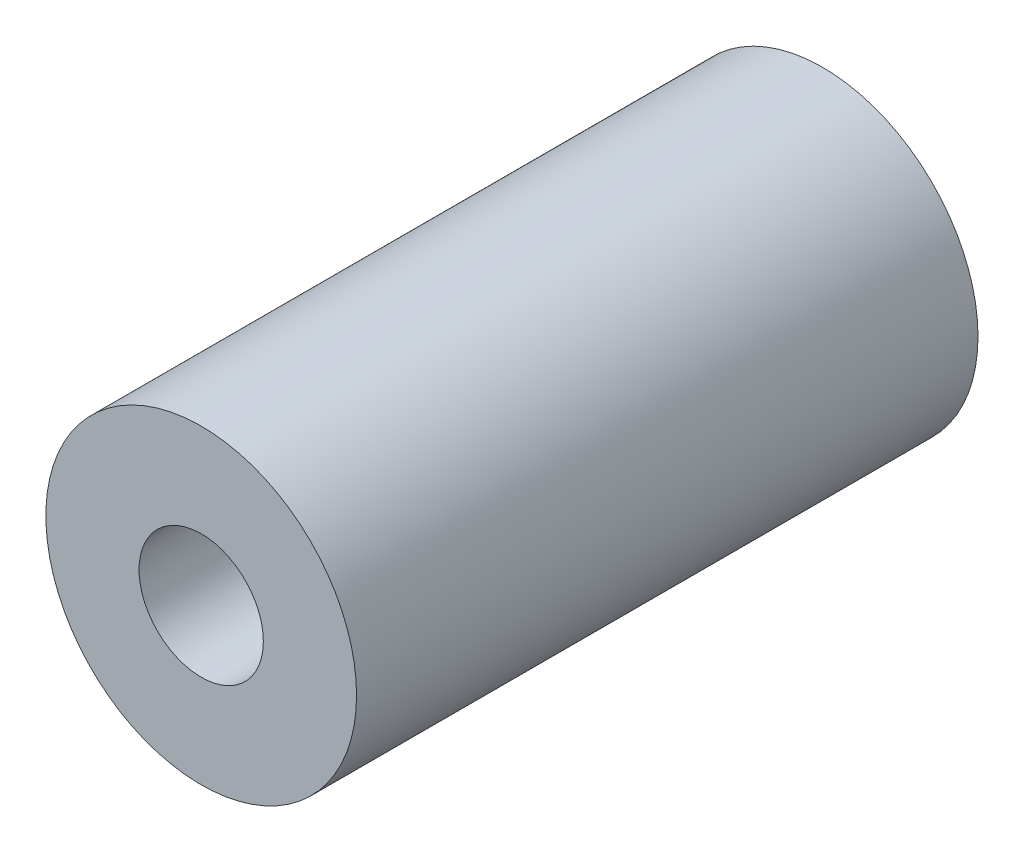
ISO-10303-21;
HEADER;
FILE_DESCRIPTION(('STEP AP214'),'2;1');
FILE_NAME('part.step','',(''),(''),'','','');
FILE_SCHEMA(('AUTOMOTIVE_DESIGN { 1 0 10303 214 1 1 1 1 }'));
ENDSEC;
DATA;
#1=APPLICATION_CONTEXT('core data for automotive mechanical design processes');
#2=APPLICATION_PROTOCOL_DEFINITION('international standard','automotive_design',2000,#1);
#3=PRODUCT_CONTEXT('',#1,'mechanical');
#4=PRODUCT('Part','Part','',(#3));
#5=PRODUCT_RELATED_PRODUCT_CATEGORY('part','',(#4));
#6=PRODUCT_DEFINITION_FORMATION('','',#4);
#7=PRODUCT_DEFINITION_CONTEXT('part definition',#1,'design');
#8=PRODUCT_DEFINITION('design','',#6,#7);
#9=PRODUCT_DEFINITION_SHAPE('','',#8);
#10=(LENGTH_UNIT() NAMED_UNIT(*) SI_UNIT(.MILLI.,.METRE.));
#11=(NAMED_UNIT(*) PLANE_ANGLE_UNIT() SI_UNIT($,.RADIAN.));
#12=(NAMED_UNIT(*) SI_UNIT($,.STERADIAN.) SOLID_ANGLE_UNIT());
#13=UNCERTAINTY_MEASURE_WITH_UNIT(LENGTH_MEASURE(1.E-05),#10,'distance_accuracy_value','');
#14=(GEOMETRIC_REPRESENTATION_CONTEXT(3) GLOBAL_UNCERTAINTY_ASSIGNED_CONTEXT((#13)) GLOBAL_UNIT_ASSIGNED_CONTEXT((#10,
#11,#12)) REPRESENTATION_CONTEXT('',''));
#15=CARTESIAN_POINT('',(0.,0.,0.));
#16=DIRECTION('',(0.,0.,1.));
#17=DIRECTION('',(1.,0.,0.));
#18=AXIS2_PLACEMENT_3D('',#15,#16,#17);
#19=CARTESIAN_POINT('',(0.,0.,-19.05));
#20=DIRECTION('',(0.,0.,1.));
#21=DIRECTION('',(1.,0.,0.));
#22=AXIS2_PLACEMENT_3D('',#19,#20,#21);
#23=CYLINDRICAL_SURFACE('',#22,9.525);
#24=CARTESIAN_POINT('',(0.,0.,-19.05));
#25=DIRECTION('',(0.,0.,1.));
#26=DIRECTION('',(1.,0.,0.));
#27=AXIS2_PLACEMENT_3D('',#24,#25,#26);
#28=CIRCLE('',#27,9.525);
#29=CARTESIAN_POINT('',(9.525,0.,-19.05));
#30=VERTEX_POINT('',#29);
#31=EDGE_CURVE('E10',#30,#30,#28,.T.);
#32=CARTESIAN_POINT('',(0.,0.,19.05));
#33=DIRECTION('',(0.,0.,1.));
#34=DIRECTION('',(1.,0.,0.));
#35=AXIS2_PLACEMENT_3D('',#32,#33,#34);
#36=CIRCLE('',#35,9.525);
#37=CARTESIAN_POINT('',(9.525,0.,19.05));
#38=VERTEX_POINT('',#37);
#39=EDGE_CURVE('E49',#38,#38,#36,.T.);
#40=CARTESIAN_POINT('',(9.525,0.,-19.05));
#41=CARTESIAN_POINT('',(9.525,0.,-18.653125));
#42=CARTESIAN_POINT('',(9.525,0.,-18.25625));
#43=CARTESIAN_POINT('',(9.525,0.,-17.4625));
#44=CARTESIAN_POINT('',(9.525,0.,-17.065625));
#45=CARTESIAN_POINT('',(9.525,0.,-16.271875));
#46=CARTESIAN_POINT('',(9.525,0.,-15.875));
#47=CARTESIAN_POINT('',(9.525,0.,-15.08125));
#48=CARTESIAN_POINT('',(9.525,0.,-14.684375));
#49=CARTESIAN_POINT('',(9.525,0.,-13.890625));
#50=CARTESIAN_POINT('',(9.525,0.,-13.49375));
#51=CARTESIAN_POINT('',(9.525,0.,-12.7));
#52=CARTESIAN_POINT('',(9.525,0.,-12.303125));
#53=CARTESIAN_POINT('',(9.525,0.,-11.509375));
#54=CARTESIAN_POINT('',(9.525,0.,-11.1125));
#55=CARTESIAN_POINT('',(9.525,0.,-10.31875));
#56=CARTESIAN_POINT('',(9.525,0.,-9.921875));
#57=CARTESIAN_POINT('',(9.525,0.,-9.128125));
#58=CARTESIAN_POINT('',(9.525,0.,-8.73125));
#59=CARTESIAN_POINT('',(9.525,0.,-7.9375));
#60=CARTESIAN_POINT('',(9.525,0.,-7.540625));
#61=CARTESIAN_POINT('',(9.525,0.,-6.746875));
#62=CARTESIAN_POINT('',(9.525,0.,-6.35));
#63=CARTESIAN_POINT('',(9.525,0.,-5.55625));
#64=CARTESIAN_POINT('',(9.525,0.,-5.159375));
#65=CARTESIAN_POINT('',(9.525,0.,-4.365625));
#66=CARTESIAN_POINT('',(9.525,0.,-3.96875));
#67=CARTESIAN_POINT('',(9.525,0.,-3.175));
#68=CARTESIAN_POINT('',(9.525,0.,-2.778125));
#69=CARTESIAN_POINT('',(9.525,0.,-1.984375));
#70=CARTESIAN_POINT('',(9.525,0.,-1.5875));
#71=CARTESIAN_POINT('',(9.525,0.,-0.79375));
#72=CARTESIAN_POINT('',(9.525,0.,-0.396875));
#73=CARTESIAN_POINT('',(9.525,0.,0.396875));
#74=CARTESIAN_POINT('',(9.525,0.,0.79375));
#75=CARTESIAN_POINT('',(9.525,0.,1.5875));
#76=CARTESIAN_POINT('',(9.525,0.,1.984375));
#77=CARTESIAN_POINT('',(9.525,0.,2.778125));
#78=CARTESIAN_POINT('',(9.525,0.,3.175));
#79=CARTESIAN_POINT('',(9.525,0.,3.96875));
#80=CARTESIAN_POINT('',(9.525,0.,4.365625));
#81=CARTESIAN_POINT('',(9.525,0.,5.159375));
#82=CARTESIAN_POINT('',(9.525,0.,5.55625));
#83=CARTESIAN_POINT('',(9.525,0.,6.35));
#84=CARTESIAN_POINT('',(9.525,0.,6.746875));
#85=CARTESIAN_POINT('',(9.525,0.,7.540625));
#86=CARTESIAN_POINT('',(9.525,0.,7.9375));
#87=CARTESIAN_POINT('',(9.525,0.,8.73125));
#88=CARTESIAN_POINT('',(9.525,0.,9.128125));
#89=CARTESIAN_POINT('',(9.525,0.,9.921875));
#90=CARTESIAN_POINT('',(9.525,0.,10.31875));
#91=CARTESIAN_POINT('',(9.525,0.,11.1125));
#92=CARTESIAN_POINT('',(9.525,0.,11.509375));
#93=CARTESIAN_POINT('',(9.525,0.,12.303125));
#94=CARTESIAN_POINT('',(9.525,0.,12.7));
#95=CARTESIAN_POINT('',(9.525,0.,13.49375));
#96=CARTESIAN_POINT('',(9.525,0.,13.890625));
#97=CARTESIAN_POINT('',(9.525,0.,14.684375));
#98=CARTESIAN_POINT('',(9.525,0.,15.08125));
#99=CARTESIAN_POINT('',(9.525,0.,15.875));
#100=CARTESIAN_POINT('',(9.525,0.,16.271875));
#101=CARTESIAN_POINT('',(9.525,0.,17.065625));
#102=CARTESIAN_POINT('',(9.525,0.,17.4625));
#103=CARTESIAN_POINT('',(9.525,0.,18.25625));
#104=CARTESIAN_POINT('',(9.525,0.,18.653125));
#105=CARTESIAN_POINT('',(9.525,0.,19.05));
#106=B_SPLINE_CURVE_WITH_KNOTS('',3,(#40,#41,#42,#43,#44,#45,#46,#47,#48,#49,#50,#51,#52,#53,
#54,#55,#56,#57,#58,#59,#60,#61,#62,#63,#64,#65,#66,#67,#68,#69,#70,#71,#72,#73,#74,#75,#76,#77,
#78,#79,#80,#81,#82,#83,#84,#85,#86,#87,#88,#89,#90,#91,#92,#93,#94,#95,#96,#97,#98,#99,#100,
#101,#102,#103,#104,#105),.UNSPECIFIED.,.F.,.F.,(4,2,2,2,2,2,2,2,2,2,2,2,2,2,2,2,2,2,2,2,2,2,2,
2,2,2,2,2,2,2,2,2,4),(0.,1.190625,2.38125,3.571875,4.7625,5.953125,7.14375,8.334375,9.525,
10.715625,11.90625,13.096875,14.2875,15.478125,16.66875,17.859375,19.05,20.240625,21.43125,
22.621875,23.8125,25.003125,26.19375,27.384375,28.575,29.765625,30.95625,32.146875,33.3375,
34.528125,35.71875,36.909375,38.1),.UNSPECIFIED.);
#107=EDGE_CURVE('BSEAM37',#30,#38,#106,.T.);
#108=ORIENTED_EDGE('',*,*,#31,.T.);
#109=ORIENTED_EDGE('',*,*,#39,.F.);
#110=ORIENTED_EDGE('',*,*,#107,.T.);
#111=ORIENTED_EDGE('',*,*,#107,.F.);
#112=EDGE_LOOP('',(#108,#110,#109,#111));
#113=FACE_BOUND('',#112,.T.);
#114=ADVANCED_FACE('F37',(#113),#23,.T.);
#115=CARTESIAN_POINT('',(0.,0.,-19.05));
#116=DIRECTION('',(0.,0.,1.));
#117=DIRECTION('',(1.,0.,0.));
#118=AXIS2_PLACEMENT_3D('',#115,#116,#117);
#119=PLANE('',#118);
#120=CARTESIAN_POINT('',(0.,0.,-19.05));
#121=DIRECTION('',(0.,0.,1.));
#122=DIRECTION('',(1.,0.,0.));
#123=AXIS2_PLACEMENT_3D('',#120,#121,#122);
#124=CIRCLE('',#123,3.81);
#125=CARTESIAN_POINT('',(3.81,0.,-19.05));
#126=VERTEX_POINT('',#125);
#127=EDGE_CURVE('E44',#126,#126,#124,.T.);
#128=ORIENTED_EDGE('',*,*,#127,.T.);
#129=EDGE_LOOP('',(#128));
#130=FACE_BOUND('',#129,.T.);
#131=ORIENTED_EDGE('',*,*,#31,.F.);
#132=EDGE_LOOP('',(#131));
#133=FACE_BOUND('',#132,.T.);
#134=ADVANCED_FACE('F70',(#130,#133),#119,.F.);
#135=CARTESIAN_POINT('',(0.,0.,-19.05));
#136=DIRECTION('',(0.,0.,1.));
#137=DIRECTION('',(1.,0.,0.));
#138=AXIS2_PLACEMENT_3D('',#135,#136,#137);
#139=CYLINDRICAL_SURFACE('',#138,3.81);
#140=CARTESIAN_POINT('',(0.,0.,19.05));
#141=DIRECTION('',(0.,0.,1.));
#142=DIRECTION('',(1.,0.,0.));
#143=AXIS2_PLACEMENT_3D('',#140,#141,#142);
#144=CIRCLE('',#143,3.81);
#145=CARTESIAN_POINT('',(3.81,0.,19.05));
#146=VERTEX_POINT('',#145);
#147=EDGE_CURVE('E54',#146,#146,#144,.T.);
#148=CARTESIAN_POINT('',(3.81,0.,-19.05));
#149=CARTESIAN_POINT('',(3.81,0.,-18.653125));
#150=CARTESIAN_POINT('',(3.81,0.,-18.25625));
#151=CARTESIAN_POINT('',(3.81,0.,-17.4625));
#152=CARTESIAN_POINT('',(3.81,0.,-17.065625));
#153=CARTESIAN_POINT('',(3.81,0.,-16.271875));
#154=CARTESIAN_POINT('',(3.81,0.,-15.875));
#155=CARTESIAN_POINT('',(3.81,0.,-15.08125));
#156=CARTESIAN_POINT('',(3.81,0.,-14.684375));
#157=CARTESIAN_POINT('',(3.81,0.,-13.890625));
#158=CARTESIAN_POINT('',(3.81,0.,-13.49375));
#159=CARTESIAN_POINT('',(3.81,0.,-12.7));
#160=CARTESIAN_POINT('',(3.81,0.,-12.303125));
#161=CARTESIAN_POINT('',(3.81,0.,-11.509375));
#162=CARTESIAN_POINT('',(3.81,0.,-11.1125));
#163=CARTESIAN_POINT('',(3.81,0.,-10.31875));
#164=CARTESIAN_POINT('',(3.81,0.,-9.921875));
#165=CARTESIAN_POINT('',(3.81,0.,-9.128125));
#166=CARTESIAN_POINT('',(3.81,0.,-8.73125));
#167=CARTESIAN_POINT('',(3.81,0.,-7.9375));
#168=CARTESIAN_POINT('',(3.81,0.,-7.540625));
#169=CARTESIAN_POINT('',(3.81,0.,-6.746875));
#170=CARTESIAN_POINT('',(3.81,0.,-6.35));
#171=CARTESIAN_POINT('',(3.81,0.,-5.55625));
#172=CARTESIAN_POINT('',(3.81,0.,-5.159375));
#173=CARTESIAN_POINT('',(3.81,0.,-4.365625));
#174=CARTESIAN_POINT('',(3.81,0.,-3.96875));
#175=CARTESIAN_POINT('',(3.81,0.,-3.175));
#176=CARTESIAN_POINT('',(3.81,0.,-2.778125));
#177=CARTESIAN_POINT('',(3.81,0.,-1.984375));
#178=CARTESIAN_POINT('',(3.81,0.,-1.5875));
#179=CARTESIAN_POINT('',(3.81,0.,-0.793750000000004));
#180=CARTESIAN_POINT('',(3.81,0.,-0.396875000000004));
#181=CARTESIAN_POINT('',(3.81,0.,0.396874999999997));
#182=CARTESIAN_POINT('',(3.81,0.,0.793749999999997));
#183=CARTESIAN_POINT('',(3.81,0.,1.5875));
#184=CARTESIAN_POINT('',(3.81,0.,1.984375));
#185=CARTESIAN_POINT('',(3.81,0.,2.778125));
#186=CARTESIAN_POINT('',(3.81,0.,3.175));
#187=CARTESIAN_POINT('',(3.81,0.,3.96875));
#188=CARTESIAN_POINT('',(3.81,0.,4.365625));
#189=CARTESIAN_POINT('',(3.81,0.,5.159375));
#190=CARTESIAN_POINT('',(3.81,0.,5.55625));
#191=CARTESIAN_POINT('',(3.81,0.,6.35));
#192=CARTESIAN_POINT('',(3.81,0.,6.746875));
#193=CARTESIAN_POINT('',(3.81,0.,7.540625));
#194=CARTESIAN_POINT('',(3.81,0.,7.9375));
#195=CARTESIAN_POINT('',(3.81,0.,8.73125));
#196=CARTESIAN_POINT('',(3.81,0.,9.128125));
#197=CARTESIAN_POINT('',(3.81,0.,9.921875));
#198=CARTESIAN_POINT('',(3.81,0.,10.31875));
#199=CARTESIAN_POINT('',(3.81,0.,11.1125));
#200=CARTESIAN_POINT('',(3.81,0.,11.509375));
#201=CARTESIAN_POINT('',(3.81,0.,12.303125));
#202=CARTESIAN_POINT('',(3.81,0.,12.7));
#203=CARTESIAN_POINT('',(3.81,0.,13.49375));
#204=CARTESIAN_POINT('',(3.81,0.,13.890625));
#205=CARTESIAN_POINT('',(3.81,0.,14.684375));
#206=CARTESIAN_POINT('',(3.81,0.,15.08125));
#207=CARTESIAN_POINT('',(3.81,0.,15.875));
#208=CARTESIAN_POINT('',(3.81,0.,16.271875));
#209=CARTESIAN_POINT('',(3.81,0.,17.065625));
#210=CARTESIAN_POINT('',(3.81,0.,17.4625));
#211=CARTESIAN_POINT('',(3.81,0.,18.25625));
#212=CARTESIAN_POINT('',(3.81,0.,18.653125));
#213=CARTESIAN_POINT('',(3.81,0.,19.05));
#214=B_SPLINE_CURVE_WITH_KNOTS('',3,(#148,#149,#150,#151,#152,#153,#154,#155,#156,#157,#158,
#159,#160,#161,#162,#163,#164,#165,#166,#167,#168,#169,#170,#171,#172,#173,#174,#175,#176,#177,
#178,#179,#180,#181,#182,#183,#184,#185,#186,#187,#188,#189,#190,#191,#192,#193,#194,#195,#196,
#197,#198,#199,#200,#201,#202,#203,#204,#205,#206,#207,#208,#209,#210,#211,#212,#213),
.UNSPECIFIED.,.F.,.F.,(4,2,2,2,2,2,2,2,2,2,2,2,2,2,2,2,2,2,2,2,2,2,2,2,2,2,2,2,2,2,2,2,4),(0.,
1.190625,2.38125,3.571875,4.7625,5.953125,7.14375,8.334375,9.525,10.715625,11.90625,13.096875,
14.2875,15.478125,16.66875,17.859375,19.05,20.240625,21.43125,22.621875,23.8125,25.003125,
26.19375,27.384375,28.575,29.765625,30.95625,32.146875,33.3375,34.528125,35.71875,36.909375,
38.1),.UNSPECIFIED.);
#215=EDGE_CURVE('BSEAM61',#126,#146,#214,.T.);
#216=ORIENTED_EDGE('',*,*,#127,.F.);
#217=ORIENTED_EDGE('',*,*,#147,.T.);
#218=ORIENTED_EDGE('',*,*,#215,.T.);
#219=ORIENTED_EDGE('',*,*,#215,.F.);
#220=EDGE_LOOP('',(#216,#218,#217,#219));
#221=FACE_BOUND('',#220,.T.);
#222=ADVANCED_FACE('F61',(#221),#139,.F.);
#223=CARTESIAN_POINT('',(0.,0.,19.05));
#224=DIRECTION('',(0.,0.,1.));
#225=DIRECTION('',(1.,0.,0.));
#226=AXIS2_PLACEMENT_3D('',#223,#224,#225);
#227=PLANE('',#226);
#228=ORIENTED_EDGE('',*,*,#39,.T.);
#229=EDGE_LOOP('',(#228));
#230=FACE_BOUND('',#229,.T.);
#231=ORIENTED_EDGE('',*,*,#147,.F.);
#232=EDGE_LOOP('',(#231));
#233=FACE_BOUND('',#232,.T.);
#234=ADVANCED_FACE('F63',(#230,#233),#227,.T.);
#235=CLOSED_SHELL('',(#114,#134,#222,#234));
#236=MANIFOLD_SOLID_BREP('B2',#235);
#237=ADVANCED_BREP_SHAPE_REPRESENTATION('',(#18,#236),#14);
#238=SHAPE_DEFINITION_REPRESENTATION(#9,#237);
ENDSEC;
END-ISO-10303-21;
